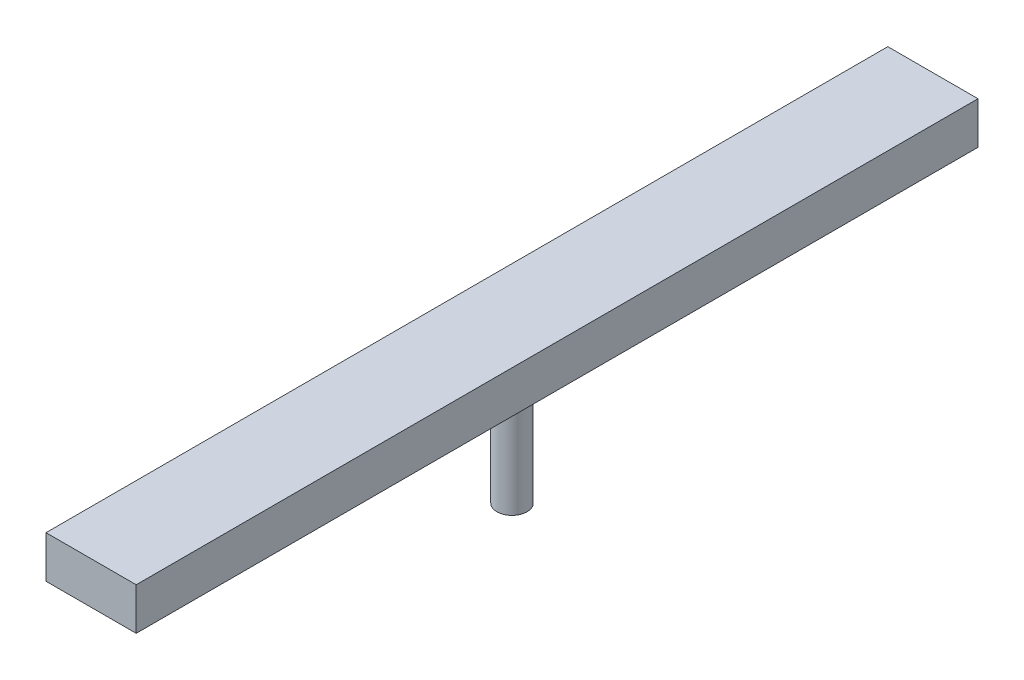
ISO-10303-21;
HEADER;
FILE_DESCRIPTION(('STEP AP214'),'2;1');
FILE_NAME('part.step','',(''),(''),'','','');
FILE_SCHEMA(('AUTOMOTIVE_DESIGN { 1 0 10303 214 1 1 1 1 }'));
ENDSEC;
DATA;
#1=APPLICATION_CONTEXT('core data for automotive mechanical design processes');
#2=APPLICATION_PROTOCOL_DEFINITION('international standard','automotive_design',2000,#1);
#3=PRODUCT_CONTEXT('',#1,'mechanical');
#4=PRODUCT('Part','Part','',(#3));
#5=PRODUCT_RELATED_PRODUCT_CATEGORY('part','',(#4));
#6=PRODUCT_DEFINITION_FORMATION('','',#4);
#7=PRODUCT_DEFINITION_CONTEXT('part definition',#1,'design');
#8=PRODUCT_DEFINITION('design','',#6,#7);
#9=PRODUCT_DEFINITION_SHAPE('','',#8);
#10=(LENGTH_UNIT() NAMED_UNIT(*) SI_UNIT(.MILLI.,.METRE.));
#11=(NAMED_UNIT(*) PLANE_ANGLE_UNIT() SI_UNIT($,.RADIAN.));
#12=(NAMED_UNIT(*) SI_UNIT($,.STERADIAN.) SOLID_ANGLE_UNIT());
#13=UNCERTAINTY_MEASURE_WITH_UNIT(LENGTH_MEASURE(1.E-05),#10,'distance_accuracy_value','');
#14=(GEOMETRIC_REPRESENTATION_CONTEXT(3) GLOBAL_UNCERTAINTY_ASSIGNED_CONTEXT((#13)) GLOBAL_UNIT_ASSIGNED_CONTEXT((#10,
#11,#12)) REPRESENTATION_CONTEXT('',''));
#15=CARTESIAN_POINT('',(0.,0.,0.));
#16=DIRECTION('',(0.,0.,1.));
#17=DIRECTION('',(1.,0.,0.));
#18=AXIS2_PLACEMENT_3D('',#15,#16,#17);
#19=CARTESIAN_POINT('',(0.,0.,70.0000002980232));
#20=DIRECTION('',(0.,0.,1.));
#21=DIRECTION('',(1.,0.,0.));
#22=AXIS2_PLACEMENT_3D('',#19,#20,#21);
#23=PLANE('',#22);
#24=DIRECTION('',(0.,-1.,0.));
#25=VECTOR('',#24,1.);
#26=CARTESIAN_POINT('',(7.49999983236194,3.50000010803342,70.0000002980232));
#27=LINE('',#26,#25);
#28=CARTESIAN_POINT('',(7.49999983236194,3.50000010803342,70.0000002980232));
#29=VERTEX_POINT('',#28);
#30=CARTESIAN_POINT('',(7.49999983236194,0.,70.0000002980232));
#31=VERTEX_POINT('',#30);
#32=EDGE_CURVE('E120',#29,#31,#27,.T.);
#33=ORIENTED_EDGE('',*,*,#32,.F.);
#34=DIRECTION('',(1.,0.,0.));
#35=VECTOR('',#34,1.);
#36=CARTESIAN_POINT('',(7.49999983236194,3.50000010803342,70.0000002980232));
#37=LINE('',#36,#35);
#38=CARTESIAN_POINT('',(0.,3.50000010803342,70.0000002980232));
#39=VERTEX_POINT('',#38);
#40=EDGE_CURVE('E78',#39,#29,#37,.T.);
#41=ORIENTED_EDGE('',*,*,#40,.F.);
#42=DIRECTION('',(0.,1.,0.));
#43=VECTOR('',#42,1.);
#44=CARTESIAN_POINT('',(0.,3.50000010803342,70.0000002980232));
#45=LINE('',#44,#43);
#46=CARTESIAN_POINT('',(0.,0.,70.0000002980232));
#47=VERTEX_POINT('',#46);
#48=EDGE_CURVE('E83',#47,#39,#45,.T.);
#49=ORIENTED_EDGE('',*,*,#48,.F.);
#50=DIRECTION('',(-1.,0.,0.));
#51=VECTOR('',#50,1.);
#52=CARTESIAN_POINT('',(7.49999983236194,0.,70.0000002980232));
#53=LINE('',#52,#51);
#54=EDGE_CURVE('E98',#31,#47,#53,.T.);
#55=ORIENTED_EDGE('',*,*,#54,.F.);
#56=EDGE_LOOP('',(#33,#41,#49,#55));
#57=FACE_BOUND('',#56,.T.);
#58=ADVANCED_FACE('F45',(#57),#23,.T.);
#59=CARTESIAN_POINT('',(0.,0.,0.));
#60=DIRECTION('',(0.,0.,-1.));
#61=DIRECTION('',(-1.,0.,0.));
#62=AXIS2_PLACEMENT_3D('',#59,#60,#61);
#63=PLANE('',#62);
#64=DIRECTION('',(0.,-1.,0.));
#65=VECTOR('',#64,1.);
#66=CARTESIAN_POINT('',(7.49999983236194,3.50000010803342,0.));
#67=LINE('',#66,#65);
#68=CARTESIAN_POINT('',(7.49999983236194,3.50000010803342,0.));
#69=VERTEX_POINT('',#68);
#70=CARTESIAN_POINT('',(7.49999983236194,0.,0.));
#71=VERTEX_POINT('',#70);
#72=EDGE_CURVE('E110',#69,#71,#67,.T.);
#73=ORIENTED_EDGE('',*,*,#72,.T.);
#74=DIRECTION('',(-1.,0.,0.));
#75=VECTOR('',#74,1.);
#76=CARTESIAN_POINT('',(7.49999983236194,0.,0.));
#77=LINE('',#76,#75);
#78=CARTESIAN_POINT('',(0.,0.,0.));
#79=VERTEX_POINT('',#78);
#80=EDGE_CURVE('E96',#71,#79,#77,.T.);
#81=ORIENTED_EDGE('',*,*,#80,.T.);
#82=DIRECTION('',(0.,1.,0.));
#83=VECTOR('',#82,1.);
#84=CARTESIAN_POINT('',(0.,3.50000010803342,0.));
#85=LINE('',#84,#83);
#86=CARTESIAN_POINT('',(0.,3.50000010803342,0.));
#87=VERTEX_POINT('',#86);
#88=EDGE_CURVE('E101',#79,#87,#85,.T.);
#89=ORIENTED_EDGE('',*,*,#88,.T.);
#90=DIRECTION('',(1.,0.,0.));
#91=VECTOR('',#90,1.);
#92=CARTESIAN_POINT('',(7.49999983236194,3.50000010803342,0.));
#93=LINE('',#92,#91);
#94=EDGE_CURVE('E107',#87,#69,#93,.T.);
#95=ORIENTED_EDGE('',*,*,#94,.T.);
#96=EDGE_LOOP('',(#73,#81,#89,#95));
#97=FACE_BOUND('',#96,.T.);
#98=ADVANCED_FACE('F109',(#97),#63,.T.);
#99=CARTESIAN_POINT('',(7.49999983236194,0.,78.2764728704216));
#100=DIRECTION('',(0.,-1.,0.));
#101=DIRECTION('',(0.,0.,-1.));
#102=AXIS2_PLACEMENT_3D('',#99,#100,#101);
#103=PLANE('',#102);
#104=CARTESIAN_POINT('',(3.75000016356773,0.,35.0000012364363));
#105=DIRECTION('',(0.,-1.,0.));
#106=DIRECTION('',(0.,0.,-1.));
#107=AXIS2_PLACEMENT_3D('',#104,#105,#106);
#108=CIRCLE('',#107,1.2499992750272);
#109=CARTESIAN_POINT('',(3.75000016356773,0.,33.7500019614091));
#110=VERTEX_POINT('',#109);
#111=EDGE_CURVE('E11',#110,#110,#108,.T.);
#112=ORIENTED_EDGE('',*,*,#111,.F.);
#113=EDGE_LOOP('',(#112));
#114=FACE_BOUND('',#113,.T.);
#115=DIRECTION('',(0.,0.,-1.));
#116=VECTOR('',#115,1.);
#117=CARTESIAN_POINT('',(7.49999983236194,0.,78.2764728704216));
#118=LINE('',#117,#116);
#119=EDGE_CURVE('E54',#31,#71,#118,.T.);
#120=ORIENTED_EDGE('',*,*,#119,.F.);
#121=ORIENTED_EDGE('',*,*,#54,.T.);
#122=DIRECTION('',(0.,0.,-1.));
#123=VECTOR('',#122,1.);
#124=CARTESIAN_POINT('',(0.,0.,78.2764728704216));
#125=LINE('',#124,#123);
#126=EDGE_CURVE('E93',#47,#79,#125,.T.);
#127=ORIENTED_EDGE('',*,*,#126,.T.);
#128=ORIENTED_EDGE('',*,*,#80,.F.);
#129=EDGE_LOOP('',(#120,#121,#127,#128));
#130=FACE_BOUND('',#129,.T.);
#131=ADVANCED_FACE('F94',(#114,#130),#103,.T.);
#132=CARTESIAN_POINT('',(0.,3.50000010803342,78.2764728704216));
#133=DIRECTION('',(-1.,0.,0.));
#134=DIRECTION('',(0.,0.,1.));
#135=AXIS2_PLACEMENT_3D('',#132,#133,#134);
#136=PLANE('',#135);
#137=ORIENTED_EDGE('',*,*,#126,.F.);
#138=ORIENTED_EDGE('',*,*,#48,.T.);
#139=DIRECTION('',(0.,0.,-1.));
#140=VECTOR('',#139,1.);
#141=CARTESIAN_POINT('',(0.,3.50000010803342,78.2764728704216));
#142=LINE('',#141,#140);
#143=EDGE_CURVE('E88',#39,#87,#142,.T.);
#144=ORIENTED_EDGE('',*,*,#143,.T.);
#145=ORIENTED_EDGE('',*,*,#88,.F.);
#146=EDGE_LOOP('',(#137,#138,#144,#145));
#147=FACE_BOUND('',#146,.T.);
#148=ADVANCED_FACE('F102',(#147),#136,.T.);
#149=CARTESIAN_POINT('',(7.49999983236194,3.50000010803342,78.2764728704216));
#150=DIRECTION('',(0.,1.,0.));
#151=DIRECTION('',(0.,0.,1.));
#152=AXIS2_PLACEMENT_3D('',#149,#150,#151);
#153=PLANE('',#152);
#154=ORIENTED_EDGE('',*,*,#143,.F.);
#155=ORIENTED_EDGE('',*,*,#40,.T.);
#156=DIRECTION('',(0.,0.,-1.));
#157=VECTOR('',#156,1.);
#158=CARTESIAN_POINT('',(7.49999983236194,3.50000010803342,78.2764728704216));
#159=LINE('',#158,#157);
#160=EDGE_CURVE('E123',#29,#69,#159,.T.);
#161=ORIENTED_EDGE('',*,*,#160,.T.);
#162=ORIENTED_EDGE('',*,*,#94,.F.);
#163=EDGE_LOOP('',(#154,#155,#161,#162));
#164=FACE_BOUND('',#163,.T.);
#165=ADVANCED_FACE('F150',(#164),#153,.T.);
#166=CARTESIAN_POINT('',(7.49999983236194,3.50000010803342,78.2764728704216));
#167=DIRECTION('',(1.,0.,0.));
#168=DIRECTION('',(0.,0.,-1.));
#169=AXIS2_PLACEMENT_3D('',#166,#167,#168);
#170=PLANE('',#169);
#171=ORIENTED_EDGE('',*,*,#160,.F.);
#172=ORIENTED_EDGE('',*,*,#32,.T.);
#173=ORIENTED_EDGE('',*,*,#119,.T.);
#174=ORIENTED_EDGE('',*,*,#72,.F.);
#175=EDGE_LOOP('',(#171,#172,#173,#174));
#176=FACE_BOUND('',#175,.T.);
#177=ADVANCED_FACE('F142',(#176),#170,.T.);
#178=CARTESIAN_POINT('',(3.75000016356773,3.53553185540002,35.0000012364363));
#179=DIRECTION('',(0.,-1.,0.));
#180=DIRECTION('',(0.,0.,-1.));
#181=AXIS2_PLACEMENT_3D('',#178,#179,#180);
#182=CYLINDRICAL_SURFACE('',#181,1.2499992750272);
#183=CARTESIAN_POINT('',(3.75000016356773,-9.99999977648258,35.0000012364363));
#184=DIRECTION('',(0.,-1.,0.));
#185=DIRECTION('',(0.,0.,-1.));
#186=AXIS2_PLACEMENT_3D('',#183,#184,#185);
#187=CIRCLE('',#186,1.2499992750272);
#188=CARTESIAN_POINT('',(3.75000016356773,-9.99999977648258,33.7500019614091));
#189=VERTEX_POINT('',#188);
#190=EDGE_CURVE('E114',#189,#189,#187,.T.);
#191=CARTESIAN_POINT('',(3.75000016356773,0.,33.7500019614091));
#192=CARTESIAN_POINT('',(3.75000016356773,-0.10416666433836,33.7500019614091));
#193=CARTESIAN_POINT('',(3.75000016356773,-0.20833332867672,33.7500019614091));
#194=CARTESIAN_POINT('',(3.75000016356773,-0.41666665735344,33.7500019614091));
#195=CARTESIAN_POINT('',(3.75000016356773,-0.5208333216918,33.7500019614091));
#196=CARTESIAN_POINT('',(3.75000016356773,-0.729166650368521,33.7500019614091));
#197=CARTESIAN_POINT('',(3.75000016356773,-0.833333314706881,33.7500019614091));
#198=CARTESIAN_POINT('',(3.75000016356773,-1.0416666433836,33.7500019614091));
#199=CARTESIAN_POINT('',(3.75000016356773,-1.14583330772196,33.7500019614091));
#200=CARTESIAN_POINT('',(3.75000016356773,-1.35416663639868,33.7500019614091));
#201=CARTESIAN_POINT('',(3.75000016356773,-1.45833330073704,33.7500019614091));
#202=CARTESIAN_POINT('',(3.75000016356773,-1.66666662941376,33.7500019614091));
#203=CARTESIAN_POINT('',(3.75000016356773,-1.77083329375212,33.7500019614091));
#204=CARTESIAN_POINT('',(3.75000016356773,-1.97916662242884,33.7500019614091));
#205=CARTESIAN_POINT('',(3.75000016356773,-2.0833332867672,33.7500019614091));
#206=CARTESIAN_POINT('',(3.75000016356773,-2.29166661544392,33.7500019614091));
#207=CARTESIAN_POINT('',(3.75000016356773,-2.39583327978228,33.7500019614091));
#208=CARTESIAN_POINT('',(3.75000016356773,-2.604166608459,33.7500019614091));
#209=CARTESIAN_POINT('',(3.75000016356773,-2.70833327279736,33.7500019614091));
#210=CARTESIAN_POINT('',(3.75000016356773,-2.91666660147408,33.7500019614091));
#211=CARTESIAN_POINT('',(3.75000016356773,-3.02083326581245,33.7500019614091));
#212=CARTESIAN_POINT('',(3.75000016356773,-3.22916659448917,33.7500019614091));
#213=CARTESIAN_POINT('',(3.75000016356773,-3.33333325882752,33.7500019614091));
#214=CARTESIAN_POINT('',(3.75000016356773,-3.54166658750425,33.7500019614091));
#215=CARTESIAN_POINT('',(3.75000016356773,-3.64583325184261,33.7500019614091));
#216=CARTESIAN_POINT('',(3.75000016356773,-3.85416658051933,33.7500019614091));
#217=CARTESIAN_POINT('',(3.75000016356773,-3.95833324485769,33.7500019614091));
#218=CARTESIAN_POINT('',(3.75000016356773,-4.16666657353441,33.7500019614091));
#219=CARTESIAN_POINT('',(3.75000016356773,-4.27083323787277,33.7500019614091));
#220=CARTESIAN_POINT('',(3.75000016356773,-4.47916656654949,33.7500019614091));
#221=CARTESIAN_POINT('',(3.75000016356773,-4.58333323088785,33.7500019614091));
#222=CARTESIAN_POINT('',(3.75000016356773,-4.79166655956457,33.7500019614091));
#223=CARTESIAN_POINT('',(3.75000016356773,-4.89583322390293,33.7500019614091));
#224=CARTESIAN_POINT('',(3.75000016356773,-5.10416655257965,33.7500019614091));
#225=CARTESIAN_POINT('',(3.75000016356773,-5.20833321691801,33.7500019614091));
#226=CARTESIAN_POINT('',(3.75000016356773,-5.41666654559473,33.7500019614091));
#227=CARTESIAN_POINT('',(3.75000016356773,-5.52083320993309,33.7500019614091));
#228=CARTESIAN_POINT('',(3.75000016356773,-5.72916653860981,33.7500019614091));
#229=CARTESIAN_POINT('',(3.75000016356773,-5.83333320294817,33.7500019614091));
#230=CARTESIAN_POINT('',(3.75000016356773,-6.04166653162489,33.7500019614091));
#231=CARTESIAN_POINT('',(3.75000016356773,-6.14583319596325,33.7500019614091));
#232=CARTESIAN_POINT('',(3.75000016356773,-6.35416652463997,33.7500019614091));
#233=CARTESIAN_POINT('',(3.75000016356773,-6.45833318897833,33.7500019614091));
#234=CARTESIAN_POINT('',(3.75000016356773,-6.66666651765505,33.7500019614091));
#235=CARTESIAN_POINT('',(3.75000016356773,-6.77083318199341,33.7500019614091));
#236=CARTESIAN_POINT('',(3.75000016356773,-6.97916651067013,33.7500019614091));
#237=CARTESIAN_POINT('',(3.75000016356773,-7.08333317500849,33.7500019614091));
#238=CARTESIAN_POINT('',(3.75000016356773,-7.29166650368521,33.7500019614091));
#239=CARTESIAN_POINT('',(3.75000016356773,-7.39583316802357,33.7500019614091));
#240=CARTESIAN_POINT('',(3.75000016356773,-7.60416649670029,33.7500019614091));
#241=CARTESIAN_POINT('',(3.75000016356773,-7.70833316103865,33.7500019614091));
#242=CARTESIAN_POINT('',(3.75000016356773,-7.91666648971537,33.7500019614091));
#243=CARTESIAN_POINT('',(3.75000016356773,-8.02083315405373,33.7500019614091));
#244=CARTESIAN_POINT('',(3.75000016356773,-8.22916648273045,33.7500019614091));
#245=CARTESIAN_POINT('',(3.75000016356773,-8.33333314706881,33.7500019614091));
#246=CARTESIAN_POINT('',(3.75000016356773,-8.54166647574553,33.7500019614091));
#247=CARTESIAN_POINT('',(3.75000016356773,-8.64583314008389,33.7500019614091));
#248=CARTESIAN_POINT('',(3.75000016356773,-8.85416646876061,33.7500019614091));
#249=CARTESIAN_POINT('',(3.75000016356773,-8.95833313309898,33.7500019614091));
#250=CARTESIAN_POINT('',(3.75000016356773,-9.16666646177569,33.7500019614091));
#251=CARTESIAN_POINT('',(3.75000016356773,-9.27083312611406,33.7500019614091));
#252=CARTESIAN_POINT('',(3.75000016356773,-9.47916645479078,33.7500019614091));
#253=CARTESIAN_POINT('',(3.75000016356773,-9.58333311912914,33.7500019614091));
#254=CARTESIAN_POINT('',(3.75000016356773,-9.79166644780586,33.7500019614091));
#255=CARTESIAN_POINT('',(3.75000016356773,-9.89583311214422,33.7500019614091));
#256=CARTESIAN_POINT('',(3.75000016356773,-9.99999977648258,33.7500019614091));
#257=B_SPLINE_CURVE_WITH_KNOTS('',3,(#191,#192,#193,#194,#195,#196,#197,#198,#199,#200,#201,
#202,#203,#204,#205,#206,#207,#208,#209,#210,#211,#212,#213,#214,#215,#216,#217,#218,#219,#220,
#221,#222,#223,#224,#225,#226,#227,#228,#229,#230,#231,#232,#233,#234,#235,#236,#237,#238,#239,
#240,#241,#242,#243,#244,#245,#246,#247,#248,#249,#250,#251,#252,#253,#254,#255,#256),
.UNSPECIFIED.,.F.,.F.,(4,2,2,2,2,2,2,2,2,2,2,2,2,2,2,2,2,2,2,2,2,2,2,2,2,2,2,2,2,2,2,2,4),(0.,
0.312499993015081,0.624999986030161,0.937499979045242,1.24999997206032,1.5624999650754,
1.87499995809048,2.18749995110556,2.49999994412064,2.81249993713572,3.12499993015081,
3.43749992316589,3.74999991618097,4.06249990919605,4.37499990221113,4.68749989522621,
4.99999988824129,5.31249988125637,5.62499987427145,5.93749986728653,6.24999986030161,
6.56249985331669,6.87499984633177,7.18749983934685,7.49999983236193,7.81249982537701,
8.12499981839209,8.43749981140718,8.74999980442226,9.06249979743734,9.37499979045242,
9.6874997834675,9.99999977648258),.UNSPECIFIED.);
#258=EDGE_CURVE('BSEAM140',#110,#189,#257,.T.);
#259=ORIENTED_EDGE('',*,*,#111,.T.);
#260=ORIENTED_EDGE('',*,*,#190,.F.);
#261=ORIENTED_EDGE('',*,*,#258,.T.);
#262=ORIENTED_EDGE('',*,*,#258,.F.);
#263=EDGE_LOOP('',(#259,#261,#260,#262));
#264=FACE_BOUND('',#263,.T.);
#265=ADVANCED_FACE('F140',(#264),#182,.T.);
#266=CARTESIAN_POINT('',(3.75000016356773,-9.99999977648258,35.0000012364363));
#267=DIRECTION('',(0.,-1.,0.));
#268=DIRECTION('',(0.,0.,-1.));
#269=AXIS2_PLACEMENT_3D('',#266,#267,#268);
#270=PLANE('',#269);
#271=ORIENTED_EDGE('',*,*,#190,.T.);
#272=EDGE_LOOP('',(#271));
#273=FACE_BOUND('',#272,.T.);
#274=ADVANCED_FACE('F138',(#273),#270,.T.);
#275=CLOSED_SHELL('',(#58,#98,#131,#148,#165,#177,#265,#274));
#276=MANIFOLD_SOLID_BREP('B2',#275);
#277=ADVANCED_BREP_SHAPE_REPRESENTATION('',(#18,#276),#14);
#278=SHAPE_DEFINITION_REPRESENTATION(#9,#277);
ENDSEC;
END-ISO-10303-21;
